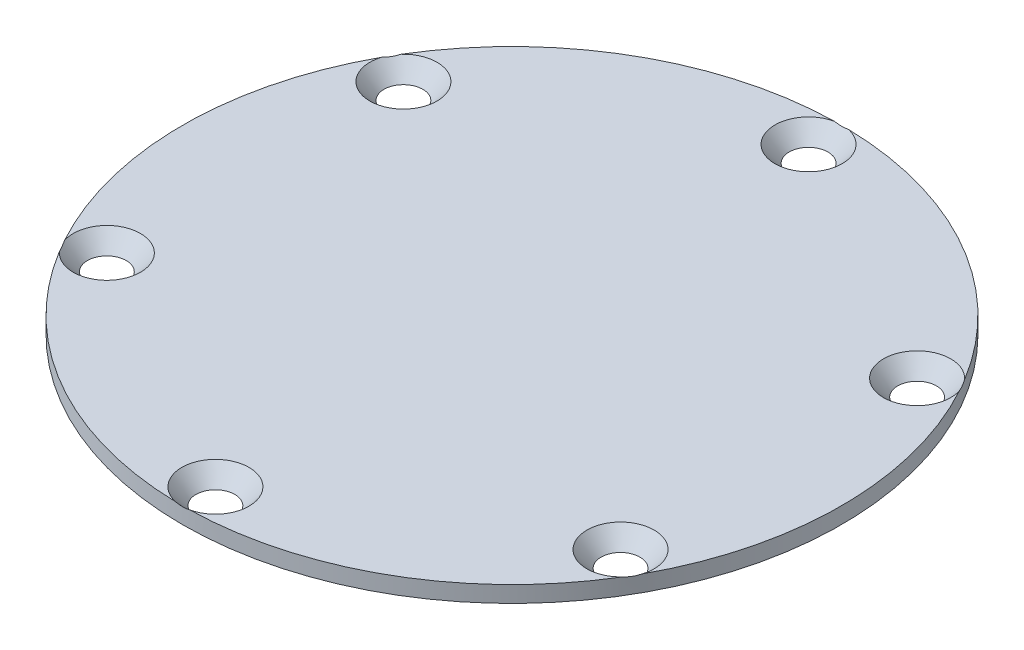
ISO-10303-21;
HEADER;
FILE_DESCRIPTION(('STEP AP214'),'2;1');
FILE_NAME('part.step','',(''),(''),'','','');
FILE_SCHEMA(('AUTOMOTIVE_DESIGN { 1 0 10303 214 1 1 1 1 }'));
ENDSEC;
DATA;
#1=APPLICATION_CONTEXT('core data for automotive mechanical design processes');
#2=APPLICATION_PROTOCOL_DEFINITION('international standard','automotive_design',2000,#1);
#3=PRODUCT_CONTEXT('',#1,'mechanical');
#4=PRODUCT('Part','Part','',(#3));
#5=PRODUCT_RELATED_PRODUCT_CATEGORY('part','',(#4));
#6=PRODUCT_DEFINITION_FORMATION('','',#4);
#7=PRODUCT_DEFINITION_CONTEXT('part definition',#1,'design');
#8=PRODUCT_DEFINITION('design','',#6,#7);
#9=PRODUCT_DEFINITION_SHAPE('','',#8);
#10=(LENGTH_UNIT() NAMED_UNIT(*) SI_UNIT(.MILLI.,.METRE.));
#11=(NAMED_UNIT(*) PLANE_ANGLE_UNIT() SI_UNIT($,.RADIAN.));
#12=(NAMED_UNIT(*) SI_UNIT($,.STERADIAN.) SOLID_ANGLE_UNIT());
#13=UNCERTAINTY_MEASURE_WITH_UNIT(LENGTH_MEASURE(1.E-05),#10,'distance_accuracy_value','');
#14=(GEOMETRIC_REPRESENTATION_CONTEXT(3) GLOBAL_UNCERTAINTY_ASSIGNED_CONTEXT((#13)) GLOBAL_UNIT_ASSIGNED_CONTEXT((#10,
#11,#12)) REPRESENTATION_CONTEXT('',''));
#15=CARTESIAN_POINT('',(0.,0.,0.));
#16=DIRECTION('',(0.,0.,1.));
#17=DIRECTION('',(1.,0.,0.));
#18=AXIS2_PLACEMENT_3D('',#15,#16,#17);
#19=CARTESIAN_POINT('',(0.,0.,0.));
#20=DIRECTION('',(0.,1.,0.));
#21=DIRECTION('',(0.,0.,1.));
#22=AXIS2_PLACEMENT_3D('',#19,#20,#21);
#23=PLANE('',#22);
#24=CARTESIAN_POINT('',(0.,0.,28.575));
#25=DIRECTION('',(0.,1.,0.));
#26=DIRECTION('',(0.,0.,1.));
#27=AXIS2_PLACEMENT_3D('',#24,#25,#26);
#28=CIRCLE('',#27,1.869547245287);
#29=CARTESIAN_POINT('',(0.,0.,30.444547245287));
#30=VERTEX_POINT('',#29);
#31=EDGE_CURVE('E93',#30,#30,#28,.T.);
#32=ORIENTED_EDGE('',*,*,#31,.T.);
#33=EDGE_LOOP('',(#32));
#34=FACE_BOUND('',#33,.T.);
#35=CARTESIAN_POINT('',(-8.12005319797207E-13,0.,-28.575));
#36=DIRECTION('',(0.,1.,0.));
#37=DIRECTION('',(0.,0.,1.));
#38=AXIS2_PLACEMENT_3D('',#35,#36,#37);
#39=CIRCLE('',#38,1.869547245287);
#40=CARTESIAN_POINT('',(-8.12005319797207E-13,0.,-26.705452754713));
#41=VERTEX_POINT('',#40);
#42=EDGE_CURVE('E139',#41,#41,#39,.T.);
#43=ORIENTED_EDGE('',*,*,#42,.T.);
#44=EDGE_LOOP('',(#43));
#45=FACE_BOUND('',#44,.T.);
#46=CARTESIAN_POINT('',(24.7466759131397,0.,-14.2875000000004));
#47=DIRECTION('',(0.,1.,0.));
#48=DIRECTION('',(0.,0.,1.));
#49=AXIS2_PLACEMENT_3D('',#46,#47,#48);
#50=CIRCLE('',#49,1.869547245287);
#51=CARTESIAN_POINT('',(24.7466759131397,0.,-12.4179527547134));
#52=VERTEX_POINT('',#51);
#53=EDGE_CURVE('E116',#52,#52,#50,.T.);
#54=ORIENTED_EDGE('',*,*,#53,.T.);
#55=EDGE_LOOP('',(#54));
#56=FACE_BOUND('',#55,.T.);
#57=CARTESIAN_POINT('',(24.7466759131402,0.,14.2875000000003));
#58=DIRECTION('',(0.,1.,0.));
#59=DIRECTION('',(0.,0.,1.));
#60=AXIS2_PLACEMENT_3D('',#57,#58,#59);
#61=CIRCLE('',#60,1.86954724528701);
#62=CARTESIAN_POINT('',(24.7466759131402,0.,16.1570472452873));
#63=VERTEX_POINT('',#62);
#64=EDGE_CURVE('E107',#63,#63,#61,.T.);
#65=ORIENTED_EDGE('',*,*,#64,.T.);
#66=EDGE_LOOP('',(#65));
#67=FACE_BOUND('',#66,.T.);
#68=CARTESIAN_POINT('',(0.,0.,0.));
#69=DIRECTION('',(0.,1.,0.));
#70=DIRECTION('',(0.,0.,1.));
#71=AXIS2_PLACEMENT_3D('',#68,#69,#70);
#72=CIRCLE('',#71,31.75);
#73=CARTESIAN_POINT('',(0.,0.,31.75));
#74=VERTEX_POINT('',#73);
#75=EDGE_CURVE('E100',#74,#74,#72,.T.);
#76=ORIENTED_EDGE('',*,*,#75,.F.);
#77=EDGE_LOOP('',(#76));
#78=FACE_BOUND('',#77,.T.);
#79=CARTESIAN_POINT('',(-24.7466759131409,0.,-14.2874999999996));
#80=DIRECTION('',(0.,1.,0.));
#81=DIRECTION('',(0.,0.,1.));
#82=AXIS2_PLACEMENT_3D('',#79,#80,#81);
#83=CIRCLE('',#82,1.869547245287);
#84=CARTESIAN_POINT('',(-24.7466759131409,0.,-12.4179527547126));
#85=VERTEX_POINT('',#84);
#86=EDGE_CURVE('E151',#85,#85,#83,.T.);
#87=ORIENTED_EDGE('',*,*,#86,.T.);
#88=EDGE_LOOP('',(#87));
#89=FACE_BOUND('',#88,.T.);
#90=CARTESIAN_POINT('',(-24.7466759131404,0.,14.2874999999999));
#91=DIRECTION('',(0.,1.,0.));
#92=DIRECTION('',(0.,0.,1.));
#93=AXIS2_PLACEMENT_3D('',#90,#91,#92);
#94=CIRCLE('',#93,1.869547245287);
#95=CARTESIAN_POINT('',(-24.7466759131404,0.,16.1570472452869));
#96=VERTEX_POINT('',#95);
#97=EDGE_CURVE('E154',#96,#96,#94,.T.);
#98=ORIENTED_EDGE('',*,*,#97,.T.);
#99=EDGE_LOOP('',(#98));
#100=FACE_BOUND('',#99,.T.);
#101=ADVANCED_FACE('F30',(#34,#45,#56,#67,#78,#89,#100),#23,.F.);
#102=CARTESIAN_POINT('',(0.,1.5748,0.));
#103=DIRECTION('',(0.,-1.,0.));
#104=DIRECTION('',(0.,0.,-1.));
#105=AXIS2_PLACEMENT_3D('',#102,#103,#104);
#106=CYLINDRICAL_SURFACE('',#105,31.75);
#107=CARTESIAN_POINT('',(0.,1.5748,0.));
#108=DIRECTION('',(0.,1.,0.));
#109=DIRECTION('',(0.,0.,1.));
#110=AXIS2_PLACEMENT_3D('',#107,#108,#109);
#111=CIRCLE('',#110,31.75);
#112=CARTESIAN_POINT('',(0.672649443689606,1.5748,31.7428738888889));
#113=VERTEX_POINT('',#112);
#114=CARTESIAN_POINT('',(27.1538104550585,1.5748,16.4539684505214));
#115=VERTEX_POINT('',#114);
#116=EDGE_CURVE('E92',#113,#115,#111,.T.);
#117=ORIENTED_EDGE('',*,*,#116,.F.);
#118=CARTESIAN_POINT('',(1.09031552451744,1.69074426435057,31.7312734074288));
#119=CARTESIAN_POINT('',(1.02214175287471,1.66767775963925,31.7336164497487));
#120=CARTESIAN_POINT('',(0.953344267765002,1.64637135807717,31.7357598974846));
#121=CARTESIAN_POINT('',(0.814389278131831,1.60763322335784,31.7396299643716));
#122=CARTESIAN_POINT('',(0.744227739597767,1.59021585322567,31.7413550403422));
#123=CARTESIAN_POINT('',(0.592579266661105,1.55755497316155,31.7445729583715));
#124=CARTESIAN_POINT('',(0.510939017258164,1.54300377414767,31.7459947516722));
#125=CARTESIAN_POINT('',(0.346743046490625,1.52022721119982,31.7482127122931));
#126=CARTESIAN_POINT('',(0.264187093915714,1.51200348358402,31.7490087177825));
#127=CARTESIAN_POINT('',(0.0988036954339166,1.50223347680404,31.7499537755481));
#128=CARTESIAN_POINT('',(0.0159768828527277,1.50067668938227,31.7501038459324));
#129=CARTESIAN_POINT('',(-0.149500184570136,1.5042797955152,31.7497557722573));
#130=CARTESIAN_POINT('',(-0.232150494198283,1.50943715732033,31.7492578725324));
#131=CARTESIAN_POINT('',(-0.374809162620884,1.52399960556356,31.7478450453665));
#132=CARTESIAN_POINT('',(-0.434977611882835,1.53190508661029,31.7470767445004));
#133=CARTESIAN_POINT('',(-0.554733878783343,1.55102448658315,31.7452099615717));
#134=CARTESIAN_POINT('',(-0.614322072097732,1.56223609431115,31.7441117101559));
#135=CARTESIAN_POINT('',(-0.790865328449437,1.60026361682261,31.7403651622483));
#136=CARTESIAN_POINT('',(-0.906852906903011,1.63160856916822,31.7372521618716));
#137=CARTESIAN_POINT('',(-1.13559223265953,1.7044875132262,31.7298922351875));
#138=CARTESIAN_POINT('',(-1.24834042327925,1.7460322595719,31.725644111589));
#139=CARTESIAN_POINT('',(-1.47095754625675,1.83753867386555,31.7161041217856));
#140=CARTESIAN_POINT('',(-1.5808088117105,1.88754228689325,31.7108070305515));
#141=CARTESIAN_POINT('',(-1.79717019831145,1.99407002722115,31.6992809508829));
#142=CARTESIAN_POINT('',(-1.90368145059756,2.05059191601523,31.693052282154));
#143=CARTESIAN_POINT('',(-2.1055013737736,2.16414709413824,31.6802585020194));
#144=CARTESIAN_POINT('',(-2.20103403341463,2.22079353006111,31.6737579607654));
#145=CARTESIAN_POINT('',(-2.38908982783487,2.33717455085278,31.6601252620092));
#146=CARTESIAN_POINT('',(-2.48163103791141,2.39688049801662,31.6529986300116));
#147=CARTESIAN_POINT('',(-2.57320401108678,2.45794436256946,31.6455545237767));
#148=B_SPLINE_CURVE_WITH_KNOTS('',3,(#118,#119,#120,#121,#122,#123,#124,#125,#126,#127,#128,
#129,#130,#131,#132,#133,#134,#135,#136,#137,#138,#139,#140,#141,#142,#143,#144,#145,#146,#147),
.UNSPECIFIED.,.F.,.F.,(4,2,2,2,2,2,2,2,2,2,2,2,2,2,4),(0.,0.216029677583202,0.43284446645297,
0.681423350246658,0.930066496291742,1.17831759290749,1.4264751069149,1.60845256445231,
1.79030310824688,2.15024015019967,2.51055835102308,2.87271865386868,3.23475495193751,
3.56843293407399,3.89941586334941),.UNSPECIFIED.);
#149=CARTESIAN_POINT('',(-0.672649443689607,1.5748,31.7428738888889));
#150=VERTEX_POINT('',#149);
#151=EDGE_CURVE('E45',#113,#150,#148,.T.);
#152=ORIENTED_EDGE('',*,*,#151,.T.);
#153=CARTESIAN_POINT('',(-27.1538104550586,1.5748,16.4539684505213));
#154=VERTEX_POINT('',#153);
#155=EDGE_CURVE('E90',#154,#150,#111,.T.);
#156=ORIENTED_EDGE('',*,*,#155,.F.);
#157=CARTESIAN_POINT('',(-25.7090932888892,2.96686947245007,18.6307547421781));
#158=CARTESIAN_POINT('',(-25.7558029542759,2.9061145620144,18.5662971672379));
#159=CARTESIAN_POINT('',(-25.8025840165621,2.84604512076919,18.5012340683505));
#160=CARTESIAN_POINT('',(-25.8963705099006,2.72756013449007,18.3697314857725));
#161=CARTESIAN_POINT('',(-25.9433760069667,2.66914511621612,18.3032915751169));
#162=CARTESIAN_POINT('',(-26.0380200996219,2.55385632820361,18.1684023687415));
#163=CARTESIAN_POINT('',(-26.0856607947693,2.49699755308415,18.0999416776304));
#164=CARTESIAN_POINT('',(-26.1812934083847,2.38569726405393,17.9613325417688));
#165=CARTESIAN_POINT('',(-26.2292852928361,2.33125551954495,17.8911842590128));
#166=CARTESIAN_POINT('',(-26.3262138021535,2.22472396644305,17.7482533857157));
#167=CARTESIAN_POINT('',(-26.3751550575029,2.1726647526061,17.6754509030112));
#168=CARTESIAN_POINT('',(-26.4735554169466,2.07217466262905,17.5277279476374));
#169=CARTESIAN_POINT('',(-26.5230146092001,2.02374441601138,17.4528071105844));
#170=CARTESIAN_POINT('',(-26.6719811501891,1.88534899264817,17.2250036870811));
#171=CARTESIAN_POINT('',(-26.7724417574076,1.80186629134991,17.0685444951165));
#172=CARTESIAN_POINT('',(-26.8970499795081,1.71535953268309,16.8704795862657));
#173=CARTESIAN_POINT('',(-26.9201968596413,1.70000124269274,16.8335208186879));
#174=CARTESIAN_POINT('',(-26.9665972341273,1.67074379114588,16.7590888193919));
#175=CARTESIAN_POINT('',(-26.9898507395945,1.65684478548343,16.7216155331905));
#176=CARTESIAN_POINT('',(-27.059728391042,1.61752311877193,16.6084752613587));
#177=CARTESIAN_POINT('',(-27.1064925822391,1.59445969033924,16.5320514694781));
#178=CARTESIAN_POINT('',(-27.1952997907478,1.55756171636189,16.3855036183536));
#179=CARTESIAN_POINT('',(-27.2373286255936,1.54301736820841,16.315549803727));
#180=CARTESIAN_POINT('',(-27.3213032859105,1.52024715981973,16.1745361294311));
#181=CARTESIAN_POINT('',(-27.3632490920152,1.51202263219393,16.1034760397116));
#182=CARTESIAN_POINT('',(-27.4467592545746,1.50223902600405,15.9607249493718));
#183=CARTESIAN_POINT('',(-27.4883238058011,1.5006763302821,15.889034312314));
#184=CARTESIAN_POINT('',(-27.5708034104708,1.50427465471337,15.745480227737));
#185=CARTESIAN_POINT('',(-27.6117186992592,1.50943317946892,15.6736168542354));
#186=CARTESIAN_POINT('',(-27.6818454500906,1.52399952571111,15.5493273329975));
#187=CARTESIAN_POINT('',(-27.7112645954442,1.53190474317245,15.4968353137275));
#188=CARTESIAN_POINT('',(-27.7695271559659,1.55102574002515,15.392187763109));
#189=CARTESIAN_POINT('',(-27.7983709837161,1.56223904871365,15.3400320102154));
#190=CARTESIAN_POINT('',(-27.8525221039375,1.58645437748631,15.2414678745939));
#191=CARTESIAN_POINT('',(-27.8778891155842,1.59915570071268,15.1950177968014));
#192=CARTESIAN_POINT('',(-27.9281176374137,1.6268812990813,15.1025004231434));
#193=CARTESIAN_POINT('',(-27.9529787827489,1.64190718795855,15.0564334167998));
#194=CARTESIAN_POINT('',(-28.0434786316505,1.7011241730249,14.8877543245464));
#195=CARTESIAN_POINT('',(-28.1074705076747,1.7519112143533,14.7665386275282));
#196=CARTESIAN_POINT('',(-28.2317285111665,1.86532732149729,14.527567506241));
#197=CARTESIAN_POINT('',(-28.291986014826,1.92798253425477,14.4098203983446));
#198=CARTESIAN_POINT('',(-28.4088816222044,2.06199281889348,14.1779673668516));
#199=CARTESIAN_POINT('',(-28.4655271091666,2.13332921627579,14.0638542709543));
#200=CARTESIAN_POINT('',(-28.5480492522899,2.24511403299085,13.8951529448884));
#201=CARTESIAN_POINT('',(-28.5750888239902,2.28307844627657,13.8394573706333));
#202=CARTESIAN_POINT('',(-28.6284462349614,2.36043576216881,13.7287412785993));
#203=CARTESIAN_POINT('',(-28.6547642684403,2.39982827362791,13.6737205814194));
#204=CARTESIAN_POINT('',(-28.6807508809696,2.43984163256622,13.6189951502952));
#205=B_SPLINE_CURVE_WITH_KNOTS('',3,(#157,#158,#159,#160,#161,#162,#163,#164,#165,#166,#167,
#168,#169,#170,#171,#172,#173,#174,#175,#176,#177,#178,#179,#180,#181,#182,#183,#184,#185,#186,
#187,#188,#189,#190,#191,#192,#193,#194,#195,#196,#197,#198,#199,#200,#201,#202,#203,#204),
.UNSPECIFIED.,.F.,.F.,(4,2,2,2,2,2,2,2,2,2,2,2,2,2,2,2,2,2,2,2,2,2,2,4),(0.,0.300422029403775,
0.600938660183381,0.9037277112612,1.20648781221931,1.51241798777635,1.81840111122929,
2.42806899035371,2.56675277728764,2.70545136464583,2.98271105984259,3.23116995732933,
3.47968123096682,3.72805755387257,3.97634168799766,4.15832347536934,4.34016968923243,
4.50339695424882,4.66673804587539,5.10443496495272,5.54310763864613,5.9808528119569,
6.19871335685714,6.41651467532562),.UNSPECIFIED.);
#206=CARTESIAN_POINT('',(-27.8264598987485,1.5748,15.2889054383674));
#207=VERTEX_POINT('',#206);
#208=EDGE_CURVE('E51',#154,#207,#205,.T.);
#209=ORIENTED_EDGE('',*,*,#208,.T.);
#210=CARTESIAN_POINT('',(-27.8264598987496,1.5748,-15.2889054383655));
#211=VERTEX_POINT('',#210);
#212=EDGE_CURVE('E97',#211,#207,#111,.T.);
#213=ORIENTED_EDGE('',*,*,#212,.F.);
#214=CARTESIAN_POINT('',(-28.6807508809696,2.43984163256554,-13.6189951502952));
#215=CARTESIAN_POINT('',(-28.6502026837812,2.39281099897732,-13.6833261070086));
#216=CARTESIAN_POINT('',(-28.6191948343647,2.34662600338928,-13.7480696765797));
#217=CARTESIAN_POINT('',(-28.5561656899829,2.25627202461598,-13.8785144215204));
#218=CARTESIAN_POINT('',(-28.5241439201654,2.21210401042353,-13.9442160375654));
#219=CARTESIAN_POINT('',(-28.4587290521825,2.12576787941639,-14.0772433857493));
#220=CARTESIAN_POINT('',(-28.4253262158327,2.08362130412721,-14.1445784075367));
#221=CARTESIAN_POINT('',(-28.3573464477859,2.00222321839922,-14.2803769165772));
#222=CARTESIAN_POINT('',(-28.3227696631357,1.9629713473141,-14.3488402619494));
#223=CARTESIAN_POINT('',(-28.2160847569931,1.84917670681963,-14.5581545110572));
#224=CARTESIAN_POINT('',(-28.1419915604474,1.77991268077186,-14.7009528382795));
#225=CARTESIAN_POINT('',(-27.9883906898915,1.66120371119353,-14.9913052409934));
#226=CARTESIAN_POINT('',(-27.9089059548047,1.61168029329836,-15.1388379149134));
#227=CARTESIAN_POINT('',(-27.7877965002054,1.55750454838951,-15.3592802429356));
#228=CARTESIAN_POINT('',(-27.7481136668105,1.54293092992399,-15.4308609938663));
#229=CARTESIAN_POINT('',(-27.6677367158913,1.52013332961282,-15.5745179968165));
#230=CARTESIAN_POINT('',(-27.6270422729994,1.51191141869284,-15.6465944027194));
#231=CARTESIAN_POINT('',(-27.5451592838983,1.50220547544207,-15.7902975496513));
#232=CARTESIAN_POINT('',(-27.5039756847959,1.50067789002984,-15.8619241605946));
#233=CARTESIAN_POINT('',(-27.4211385181659,1.50430542284589,-16.0047014811993));
#234=CARTESIAN_POINT('',(-27.3794851387196,1.50945795462284,-16.0758523643369));
#235=CARTESIAN_POINT('',(-27.3070476076877,1.52399720460283,-16.198496695348));
#236=CARTESIAN_POINT('',(-27.2763099282254,1.53189896526217,-16.2502000399222));
#237=CARTESIAN_POINT('',(-27.2148151289313,1.55101581844783,-16.3529790996471));
#238=CARTESIAN_POINT('',(-27.1840580078059,1.56223116134305,-16.4040547670678));
#239=CARTESIAN_POINT('',(-27.0925960073273,1.60023613514642,-16.5549829456446));
#240=CARTESIAN_POINT('',(-27.0319721863701,1.63154037355943,-16.6537686125631));
#241=CARTESIAN_POINT('',(-26.9113598463361,1.7043171369459,-16.8479765550071));
#242=CARTESIAN_POINT('',(-26.8513720531188,1.74580019743876,-16.9433952277512));
#243=CARTESIAN_POINT('',(-26.7318001793794,1.83726900311887,-17.1314291175858));
#244=CARTESIAN_POINT('',(-26.6722222373958,1.8873145744703,-17.2240188020181));
#245=CARTESIAN_POINT('',(-26.5539291420616,1.99394271269451,-17.4058355051018));
#246=CARTESIAN_POINT('',(-26.4952137476933,2.05052341275819,-17.4950634744414));
#247=CARTESIAN_POINT('',(-26.3743811759257,2.1730481948581,-17.6767432592334));
#248=CARTESIAN_POINT('',(-26.3123187513251,2.2393719328977,-17.7689736048807));
#249=CARTESIAN_POINT('',(-26.1888724991603,2.37664516651534,-17.9504177294193));
#250=CARTESIAN_POINT('',(-26.1274888476866,2.44759583096457,-18.0396307373479));
#251=CARTESIAN_POINT('',(-26.0063848925868,2.59176358614801,-18.2137720332748));
#252=CARTESIAN_POINT('',(-25.9466548886632,2.66491396193897,-18.2987491555541));
#253=CARTESIAN_POINT('',(-25.8276103395807,2.81397516969903,-18.4663900411613));
#254=CARTESIAN_POINT('',(-25.7682954918466,2.88988367018021,-18.5490556584336));
#255=CARTESIAN_POINT('',(-25.7090932888893,2.9668694724501,-18.6307547421779));
#256=B_SPLINE_CURVE_WITH_KNOTS('',3,(#214,#215,#216,#217,#218,#219,#220,#221,#222,#223,#224,
#225,#226,#227,#228,#229,#230,#231,#232,#233,#234,#235,#236,#237,#238,#239,#240,#241,#242,#243,
#244,#245,#246,#247,#248,#249,#250,#251,#252,#253,#254,#255),.UNSPECIFIED.,.F.,.F.,(4,2,2,2,2,2,
2,2,2,2,2,2,2,2,2,2,2,2,2,2,4),(0.,0.25603818468856,0.512198107637384,0.77066024676697,
1.02909012994181,1.55362370598238,2.07605080863036,2.32523360605356,2.57449761337426,
2.82213748587317,3.06968150418025,3.25158863168719,3.43350950731862,3.79305511101279,
4.15297444142355,4.51551968798688,4.87796162569673,5.26615859448011,5.65445401378234,
6.03552608384764,6.41628319762395),.UNSPECIFIED.);
#257=CARTESIAN_POINT('',(-27.1538104550581,1.5748,-16.4539684505221));
#258=VERTEX_POINT('',#257);
#259=EDGE_CURVE('E166',#211,#258,#256,.T.);
#260=ORIENTED_EDGE('',*,*,#259,.T.);
#261=CARTESIAN_POINT('',(-0.672649443690508,1.5748,-31.7428738888889));
#262=VERTEX_POINT('',#261);
#263=EDGE_CURVE('E99',#262,#258,#111,.T.);
#264=ORIENTED_EDGE('',*,*,#263,.F.);
#265=CARTESIAN_POINT('',(-1.0903155245183,1.69074426435056,-31.7312734074287));
#266=CARTESIAN_POINT('',(-1.02214175287558,1.66767775963924,-31.7336164497487));
#267=CARTESIAN_POINT('',(-0.95334426776588,1.64637135807716,-31.7357598974846));
#268=CARTESIAN_POINT('',(-0.81438927813272,1.60763322335784,-31.7396299643716));
#269=CARTESIAN_POINT('',(-0.744227739598661,1.59021585322567,-31.7413550403422));
#270=CARTESIAN_POINT('',(-0.592579266662004,1.55755497316155,-31.7445729583715));
#271=CARTESIAN_POINT('',(-0.510939017259064,1.54300377414766,-31.7459947516722));
#272=CARTESIAN_POINT('',(-0.346743046491525,1.52022721119981,-31.7482127122931));
#273=CARTESIAN_POINT('',(-0.264187093916615,1.51200348358402,-31.7490087177825));
#274=CARTESIAN_POINT('',(-0.098803695434817,1.50223347680404,-31.7499537755481));
#275=CARTESIAN_POINT('',(-0.0159768828536282,1.50067668938227,-31.7501038459324));
#276=CARTESIAN_POINT('',(0.149500184569235,1.50427979551519,-31.7497557722573));
#277=CARTESIAN_POINT('',(0.232150494197383,1.50943715732032,-31.7492578725324));
#278=CARTESIAN_POINT('',(0.374809162619984,1.52399960556356,-31.7478450453665));
#279=CARTESIAN_POINT('',(0.434977611881935,1.53190508661029,-31.7470767445004));
#280=CARTESIAN_POINT('',(0.554733878782443,1.55102448658315,-31.7452099615717));
#281=CARTESIAN_POINT('',(0.614322072096833,1.56223609431116,-31.7441117101559));
#282=CARTESIAN_POINT('',(0.790865328448538,1.60026361682261,-31.7403651622483));
#283=CARTESIAN_POINT('',(0.906852906902113,1.63160856916822,-31.7372521618716));
#284=CARTESIAN_POINT('',(1.13559223265863,1.7044875132262,-31.7298922351875));
#285=CARTESIAN_POINT('',(1.24834042327835,1.74603225957191,-31.725644111589));
#286=CARTESIAN_POINT('',(1.47095754625585,1.83753867386555,-31.7161041217857));
#287=CARTESIAN_POINT('',(1.58080881170961,1.88754228689325,-31.7108070305515));
#288=CARTESIAN_POINT('',(1.79717019831056,1.99407002722115,-31.699280950883));
#289=CARTESIAN_POINT('',(1.90368145059666,2.05059191601523,-31.693052282154));
#290=CARTESIAN_POINT('',(2.10550137377273,2.16414709413825,-31.6802585020194));
#291=CARTESIAN_POINT('',(2.20103403341377,2.22079353006113,-31.6737579607654));
#292=CARTESIAN_POINT('',(2.38908982783405,2.33717455085282,-31.6601252620093));
#293=CARTESIAN_POINT('',(2.4816310379106,2.39688049801667,-31.6529986300117));
#294=CARTESIAN_POINT('',(2.57320401108598,2.45794436256952,-31.6455545237768));
#295=B_SPLINE_CURVE_WITH_KNOTS('',3,(#265,#266,#267,#268,#269,#270,#271,#272,#273,#274,#275,
#276,#277,#278,#279,#280,#281,#282,#283,#284,#285,#286,#287,#288,#289,#290,#291,#292,#293,#294),
.UNSPECIFIED.,.F.,.F.,(4,2,2,2,2,2,2,2,2,2,2,2,2,2,4),(0.,0.216029677583185,0.432844466452935,
0.681423350246622,0.930066496291707,1.17831759290746,1.42647510691486,1.60845256445228,
1.79030310824685,2.15024015019963,2.51055835102305,2.87271865386865,3.23475495193747,
3.56843293407402,3.89941586334949),.UNSPECIFIED.);
#296=CARTESIAN_POINT('',(0.672649443688706,1.5748,-31.7428738888889));
#297=VERTEX_POINT('',#296);
#298=EDGE_CURVE('E186',#262,#297,#295,.T.);
#299=ORIENTED_EDGE('',*,*,#298,.T.);
#300=CARTESIAN_POINT('',(27.1538104550592,1.5748,-16.4539684505203));
#301=VERTEX_POINT('',#300);
#302=EDGE_CURVE('E106',#301,#297,#111,.T.);
#303=ORIENTED_EDGE('',*,*,#302,.F.);
#304=CARTESIAN_POINT('',(25.709093288889,2.96686947245003,-18.6307547421784));
#305=CARTESIAN_POINT('',(25.7558029542757,2.90611456201438,-18.5662971672382));
#306=CARTESIAN_POINT('',(25.8025840165618,2.8460451207692,-18.5012340683508));
#307=CARTESIAN_POINT('',(25.8963705099003,2.72756013449013,-18.3697314857728));
#308=CARTESIAN_POINT('',(25.9433760069665,2.66914511621621,-18.3032915751173));
#309=CARTESIAN_POINT('',(26.0380200996216,2.55385632820375,-18.168402368742));
#310=CARTESIAN_POINT('',(26.085660794769,2.4969975530843,-18.0999416776309));
#311=CARTESIAN_POINT('',(26.1812934083843,2.38569726405413,-17.9613325417693));
#312=CARTESIAN_POINT('',(26.2292852928357,2.33125551954518,-17.8911842590133));
#313=CARTESIAN_POINT('',(26.3262138021531,2.22472396644331,-17.7482533857163));
#314=CARTESIAN_POINT('',(26.3751550575025,2.17266475260636,-17.6754509030117));
#315=CARTESIAN_POINT('',(26.4735554169463,2.07217466262933,-17.5277279476379));
#316=CARTESIAN_POINT('',(26.5230146091997,2.02374441601166,-17.4528071105849));
#317=CARTESIAN_POINT('',(26.6719811501887,1.88534899264846,-17.2250036870816));
#318=CARTESIAN_POINT('',(26.7724417574072,1.80186629135021,-17.068544495117));
#319=CARTESIAN_POINT('',(26.8970499795082,1.71535953268313,-16.8704795862656));
#320=CARTESIAN_POINT('',(26.9201968596418,1.70000124269253,-16.8335208186872));
#321=CARTESIAN_POINT('',(26.9665972341286,1.67074379114523,-16.7590888193898));
#322=CARTESIAN_POINT('',(26.9898507395962,1.65684478548258,-16.7216155331878));
#323=CARTESIAN_POINT('',(27.0597283910449,1.61752311877057,-16.608475261354));
#324=CARTESIAN_POINT('',(27.1064925822429,1.59445969033768,-16.532051469472));
#325=CARTESIAN_POINT('',(27.1952997907523,1.55756171636048,-16.3855036183462));
#326=CARTESIAN_POINT('',(27.2373286255981,1.54301736820724,-16.3155498037196));
#327=CARTESIAN_POINT('',(27.3213032859149,1.52024715981906,-16.1745361294236));
#328=CARTESIAN_POINT('',(27.3632490920196,1.51202263219352,-16.1034760397041));
#329=CARTESIAN_POINT('',(27.4467592545789,1.50223902600415,-15.9607249493643));
#330=CARTESIAN_POINT('',(27.4883238058054,1.50067633028246,-15.8890343123065));
#331=CARTESIAN_POINT('',(27.570803410475,1.50427465471423,-15.7454802277295));
#332=CARTESIAN_POINT('',(27.6117186992634,1.50943317947003,-15.673616854228));
#333=CARTESIAN_POINT('',(27.6818454500932,1.52399952571231,-15.5493273329929));
#334=CARTESIAN_POINT('',(27.7112645954452,1.53190474317332,-15.4968353137256));
#335=CARTESIAN_POINT('',(27.7695271559639,1.55102574002501,-15.3921877631125));
#336=CARTESIAN_POINT('',(27.7983709837126,1.56223904871283,-15.3400320102217));
#337=CARTESIAN_POINT('',(27.8525221039334,1.58645437748487,-15.2414678746014));
#338=CARTESIAN_POINT('',(27.8778891155809,1.59915570071152,-15.1950177968075));
#339=CARTESIAN_POINT('',(27.928117637412,1.62688129908085,-15.1025004231467));
#340=CARTESIAN_POINT('',(27.9529787827479,1.64190718795852,-15.0564334168016));
#341=CARTESIAN_POINT('',(28.0434786316503,1.70112417302538,-14.8877543245467));
#342=CARTESIAN_POINT('',(28.1074705076745,1.75191121435381,-14.7665386275286));
#343=CARTESIAN_POINT('',(28.2317285111664,1.86532732149787,-14.5275675062413));
#344=CARTESIAN_POINT('',(28.2919860148259,1.92798253425538,-14.4098203983448));
#345=CARTESIAN_POINT('',(28.4088816222043,2.06199281889414,-14.1779673668518));
#346=CARTESIAN_POINT('',(28.4655271091666,2.13332921627645,-14.0638542709544));
#347=CARTESIAN_POINT('',(28.5480492522898,2.24511403299153,-13.8951529448886));
#348=CARTESIAN_POINT('',(28.5750888239902,2.28307844627725,-13.8394573706334));
#349=CARTESIAN_POINT('',(28.6284462349613,2.3604357621695,-13.7287412785995));
#350=CARTESIAN_POINT('',(28.6547642684402,2.39982827362861,-13.6737205814195));
#351=CARTESIAN_POINT('',(28.6807508809695,2.43984163256693,-13.6189951502953));
#352=B_SPLINE_CURVE_WITH_KNOTS('',3,(#304,#305,#306,#307,#308,#309,#310,#311,#312,#313,#314,
#315,#316,#317,#318,#319,#320,#321,#322,#323,#324,#325,#326,#327,#328,#329,#330,#331,#332,#333,
#334,#335,#336,#337,#338,#339,#340,#341,#342,#343,#344,#345,#346,#347,#348,#349,#350,#351),
.UNSPECIFIED.,.F.,.F.,(4,2,2,2,2,2,2,2,2,2,2,2,2,2,2,2,2,2,2,2,2,2,2,4),(0.,0.300422029403671,
0.600938660183175,0.903727711260884,1.20648781221889,1.51241798777594,1.81840111122889,
2.42806899035333,2.56675277728963,2.70545136465021,2.98271105985169,3.23116995733832,
3.47968123097571,3.72805755388137,3.97634168800635,4.15832347536856,4.34016968922219,
4.50339695424355,4.6667380458751,5.10443496495259,5.54310763864617,5.98085281195698,
6.19871335685723,6.41651467532572),.UNSPECIFIED.);
#353=CARTESIAN_POINT('',(27.8264598987472,1.5748,-15.2889054383698));
#354=VERTEX_POINT('',#353);
#355=EDGE_CURVE('E193',#301,#354,#352,.T.);
#356=ORIENTED_EDGE('',*,*,#355,.T.);
#357=CARTESIAN_POINT('',(27.8264598987481,1.5748,15.2889054383681));
#358=VERTEX_POINT('',#357);
#359=EDGE_CURVE('E101',#358,#354,#111,.T.);
#360=ORIENTED_EDGE('',*,*,#359,.F.);
#361=CARTESIAN_POINT('',(28.6807508809694,2.43984163256625,13.6189951502955));
#362=CARTESIAN_POINT('',(28.650202683781,2.39281099897798,13.683326107009));
#363=CARTESIAN_POINT('',(28.6191948343644,2.34662600338987,13.7480696765802));
#364=CARTESIAN_POINT('',(28.5561656899825,2.25627202461646,13.8785144215211));
#365=CARTESIAN_POINT('',(28.524143920165,2.21210401042395,13.9442160375662));
#366=CARTESIAN_POINT('',(28.4587290521821,2.12576787941671,14.0772433857503));
#367=CARTESIAN_POINT('',(28.4253262158322,2.08362130412748,14.1445784075378));
#368=CARTESIAN_POINT('',(28.3573464477853,2.0022232183994,14.2803769165784));
#369=CARTESIAN_POINT('',(28.322769663135,1.96297134731424,14.3488402619507));
#370=CARTESIAN_POINT('',(28.2160847569923,1.84917670681965,14.5581545110587));
#371=CARTESIAN_POINT('',(28.1419915604464,1.77991268077184,14.7009528382812));
#372=CARTESIAN_POINT('',(27.9883906898904,1.66120371119347,14.9913052409955));
#373=CARTESIAN_POINT('',(27.9089059548034,1.61168029329831,15.1388379149157));
#374=CARTESIAN_POINT('',(27.787796500204,1.55750454838955,15.3592802429382));
#375=CARTESIAN_POINT('',(27.7481136668091,1.54293092992408,15.4308609938688));
#376=CARTESIAN_POINT('',(27.6677367158899,1.52013332961301,15.574517996819));
#377=CARTESIAN_POINT('',(27.627042272998,1.51191141869308,15.6465944027219));
#378=CARTESIAN_POINT('',(27.5451592838968,1.50220547544242,15.7902975496538));
#379=CARTESIAN_POINT('',(27.5039756847945,1.50067789003024,15.8619241605971));
#380=CARTESIAN_POINT('',(27.4211385181644,1.50430542284639,16.0047014812018));
#381=CARTESIAN_POINT('',(27.3794851387181,1.50945795462338,16.0758523643394));
#382=CARTESIAN_POINT('',(27.3070476076865,1.5239972046034,16.1984966953501));
#383=CARTESIAN_POINT('',(27.2763099282244,1.5318989652627,16.2502000399238));
#384=CARTESIAN_POINT('',(27.2148151289309,1.55101581844819,16.3529790996478));
#385=CARTESIAN_POINT('',(27.1840580078057,1.5622311613433,16.404054767068));
#386=CARTESIAN_POINT('',(27.0925960073274,1.60023613514647,16.5549829456444));
#387=CARTESIAN_POINT('',(27.0319721863703,1.63154037355942,16.6537686125629));
#388=CARTESIAN_POINT('',(26.9113598463363,1.70431713694577,16.8479765550068));
#389=CARTESIAN_POINT('',(26.851372053119,1.74580019743857,16.9433952277509));
#390=CARTESIAN_POINT('',(26.7318001793797,1.83726900311855,17.1314291175853));
#391=CARTESIAN_POINT('',(26.6722222373961,1.88731457446991,17.2240188020176));
#392=CARTESIAN_POINT('',(26.5539291420619,1.99394271269399,17.4058355051013));
#393=CARTESIAN_POINT('',(26.4952137476937,2.0505234127576,17.4950634744409));
#394=CARTESIAN_POINT('',(26.374381175926,2.17304819485747,17.6767432592329));
#395=CARTESIAN_POINT('',(26.3123187513254,2.23937193289711,17.7689736048803));
#396=CARTESIAN_POINT('',(26.1888724991604,2.37664516651482,17.9504177294191));
#397=CARTESIAN_POINT('',(26.1274888476867,2.4475958309641,18.0396307373478));
#398=CARTESIAN_POINT('',(26.0063848925867,2.59176358614764,18.2137720332749));
#399=CARTESIAN_POINT('',(25.9466548886631,2.66491396193865,18.2987491555543));
#400=CARTESIAN_POINT('',(25.8276103395805,2.81397516969881,18.4663900411616));
#401=CARTESIAN_POINT('',(25.7682954918464,2.88988367018005,18.549055658434));
#402=CARTESIAN_POINT('',(25.709093288889,2.96686947245001,18.6307547421784));
#403=B_SPLINE_CURVE_WITH_KNOTS('',3,(#361,#362,#363,#364,#365,#366,#367,#368,#369,#370,#371,
#372,#373,#374,#375,#376,#377,#378,#379,#380,#381,#382,#383,#384,#385,#386,#387,#388,#389,#390,
#391,#392,#393,#394,#395,#396,#397,#398,#399,#400,#401,#402),.UNSPECIFIED.,.F.,.F.,(4,2,2,2,2,2,
2,2,2,2,2,2,2,2,2,2,2,2,2,2,4),(0.,0.256038184688876,0.51219810763802,0.770660246767936,
1.02909012994311,1.55362370598432,2.07605080863294,2.32523360605614,2.57449761337683,
2.82213748587575,3.06968150418284,3.2515886316882,3.43350950731805,3.79305511101203,
4.1529744414226,4.51551968798572,4.8779616256954,5.26615859447913,5.65445401378172,
6.03552608384735,6.41628319762399),.UNSPECIFIED.);
#404=EDGE_CURVE('E105',#358,#115,#403,.T.);
#405=ORIENTED_EDGE('',*,*,#404,.T.);
#406=EDGE_LOOP('',(#117,#152,#156,#209,#213,#260,#264,#299,#303,#356,#360,#405));
#407=FACE_BOUND('',#406,.T.);
#408=ORIENTED_EDGE('',*,*,#75,.T.);
#409=EDGE_LOOP('',(#408));
#410=FACE_BOUND('',#409,.T.);
#411=ADVANCED_FACE('F32',(#407,#410),#106,.T.);
#412=CARTESIAN_POINT('',(0.,1.5748,0.));
#413=DIRECTION('',(0.,1.,0.));
#414=DIRECTION('',(0.,0.,1.));
#415=AXIS2_PLACEMENT_3D('',#412,#413,#414);
#416=PLANE('',#415);
#417=CARTESIAN_POINT('',(0.,1.5748,28.575));
#418=DIRECTION('',(0.,1.,0.));
#419=DIRECTION('',(0.,0.,1.));
#420=AXIS2_PLACEMENT_3D('',#417,#418,#419);
#421=CIRCLE('',#420,3.2385);
#422=EDGE_CURVE('E80',#113,#150,#421,.T.);
#423=ORIENTED_EDGE('',*,*,#422,.F.);
#424=ORIENTED_EDGE('',*,*,#116,.T.);
#425=CARTESIAN_POINT('',(24.7466759131402,1.5748,14.2875000000003));
#426=DIRECTION('',(0.,1.,0.));
#427=DIRECTION('',(0.,0.,1.));
#428=AXIS2_PLACEMENT_3D('',#425,#426,#427);
#429=CIRCLE('',#428,3.2385);
#430=EDGE_CURVE('E198',#358,#115,#429,.T.);
#431=ORIENTED_EDGE('',*,*,#430,.F.);
#432=ORIENTED_EDGE('',*,*,#359,.T.);
#433=CARTESIAN_POINT('',(24.7466759131397,1.5748,-14.2875000000004));
#434=DIRECTION('',(0.,1.,0.));
#435=DIRECTION('',(0.,0.,1.));
#436=AXIS2_PLACEMENT_3D('',#433,#434,#435);
#437=CIRCLE('',#436,3.2385);
#438=EDGE_CURVE('E39',#301,#354,#437,.T.);
#439=ORIENTED_EDGE('',*,*,#438,.F.);
#440=ORIENTED_EDGE('',*,*,#302,.T.);
#441=CARTESIAN_POINT('',(-8.12005319797207E-13,1.5748,-28.575));
#442=DIRECTION('',(0.,1.,0.));
#443=DIRECTION('',(0.,0.,1.));
#444=AXIS2_PLACEMENT_3D('',#441,#442,#443);
#445=CIRCLE('',#444,3.2385);
#446=EDGE_CURVE('E173',#262,#297,#445,.T.);
#447=ORIENTED_EDGE('',*,*,#446,.F.);
#448=ORIENTED_EDGE('',*,*,#263,.T.);
#449=CARTESIAN_POINT('',(-24.7466759131409,1.5748,-14.2874999999996));
#450=DIRECTION('',(0.,1.,0.));
#451=DIRECTION('',(0.,0.,1.));
#452=AXIS2_PLACEMENT_3D('',#449,#450,#451);
#453=CIRCLE('',#452,3.2385);
#454=EDGE_CURVE('E156',#211,#258,#453,.T.);
#455=ORIENTED_EDGE('',*,*,#454,.F.);
#456=ORIENTED_EDGE('',*,*,#212,.T.);
#457=CARTESIAN_POINT('',(-24.7466759131404,1.5748,14.2874999999999));
#458=DIRECTION('',(0.,1.,0.));
#459=DIRECTION('',(0.,0.,1.));
#460=AXIS2_PLACEMENT_3D('',#457,#458,#459);
#461=CIRCLE('',#460,3.2385);
#462=EDGE_CURVE('E11',#154,#207,#461,.T.);
#463=ORIENTED_EDGE('',*,*,#462,.F.);
#464=ORIENTED_EDGE('',*,*,#155,.T.);
#465=EDGE_LOOP('',(#423,#424,#431,#432,#439,#440,#447,#448,#455,#456,#463,#464));
#466=FACE_BOUND('',#465,.T.);
#467=ADVANCED_FACE('F95',(#466),#416,.T.);
#468=CARTESIAN_POINT('',(24.7466759131402,1.5748,14.2875000000003));
#469=DIRECTION('',(0.,1.,0.));
#470=DIRECTION('',(0.,0.,1.));
#471=AXIS2_PLACEMENT_3D('',#468,#469,#470);
#472=CONICAL_SURFACE('',#471,3.2385,0.715584993317676);
#473=ORIENTED_EDGE('',*,*,#430,.T.);
#474=ORIENTED_EDGE('',*,*,#404,.F.);
#475=EDGE_LOOP('',(#473,#474));
#476=FACE_BOUND('',#475,.T.);
#477=ORIENTED_EDGE('',*,*,#64,.F.);
#478=EDGE_LOOP('',(#477));
#479=FACE_BOUND('',#478,.T.);
#480=ADVANCED_FACE('F118',(#476,#479),#472,.F.);
#481=CARTESIAN_POINT('',(24.7466759131397,1.5748,-14.2875000000004));
#482=DIRECTION('',(0.,1.,0.));
#483=DIRECTION('',(0.,0.,1.));
#484=AXIS2_PLACEMENT_3D('',#481,#482,#483);
#485=CONICAL_SURFACE('',#484,3.2385,0.715584993317676);
#486=ORIENTED_EDGE('',*,*,#53,.F.);
#487=EDGE_LOOP('',(#486));
#488=FACE_BOUND('',#487,.T.);
#489=ORIENTED_EDGE('',*,*,#438,.T.);
#490=ORIENTED_EDGE('',*,*,#355,.F.);
#491=EDGE_LOOP('',(#489,#490));
#492=FACE_BOUND('',#491,.T.);
#493=ADVANCED_FACE('F123',(#488,#492),#485,.F.);
#494=CARTESIAN_POINT('',(-8.12005319797207E-13,1.5748,-28.575));
#495=DIRECTION('',(0.,1.,0.));
#496=DIRECTION('',(0.,0.,1.));
#497=AXIS2_PLACEMENT_3D('',#494,#495,#496);
#498=CONICAL_SURFACE('',#497,3.2385,0.715584993317676);
#499=ORIENTED_EDGE('',*,*,#42,.F.);
#500=EDGE_LOOP('',(#499));
#501=FACE_BOUND('',#500,.T.);
#502=ORIENTED_EDGE('',*,*,#446,.T.);
#503=ORIENTED_EDGE('',*,*,#298,.F.);
#504=EDGE_LOOP('',(#502,#503));
#505=FACE_BOUND('',#504,.T.);
#506=ADVANCED_FACE('F179',(#501,#505),#498,.F.);
#507=CARTESIAN_POINT('',(-24.7466759131409,1.5748,-14.2874999999996));
#508=DIRECTION('',(0.,1.,0.));
#509=DIRECTION('',(0.,0.,1.));
#510=AXIS2_PLACEMENT_3D('',#507,#508,#509);
#511=CONICAL_SURFACE('',#510,3.2385,0.715584993317676);
#512=ORIENTED_EDGE('',*,*,#86,.F.);
#513=EDGE_LOOP('',(#512));
#514=FACE_BOUND('',#513,.T.);
#515=ORIENTED_EDGE('',*,*,#454,.T.);
#516=ORIENTED_EDGE('',*,*,#259,.F.);
#517=EDGE_LOOP('',(#515,#516));
#518=FACE_BOUND('',#517,.T.);
#519=ADVANCED_FACE('F175',(#514,#518),#511,.F.);
#520=CARTESIAN_POINT('',(-24.7466759131404,1.5748,14.2874999999999));
#521=DIRECTION('',(0.,1.,0.));
#522=DIRECTION('',(0.,0.,1.));
#523=AXIS2_PLACEMENT_3D('',#520,#521,#522);
#524=CONICAL_SURFACE('',#523,3.2385,0.715584993317676);
#525=ORIENTED_EDGE('',*,*,#462,.T.);
#526=ORIENTED_EDGE('',*,*,#208,.F.);
#527=EDGE_LOOP('',(#525,#526));
#528=FACE_BOUND('',#527,.T.);
#529=ORIENTED_EDGE('',*,*,#97,.F.);
#530=EDGE_LOOP('',(#529));
#531=FACE_BOUND('',#530,.T.);
#532=ADVANCED_FACE('F178',(#528,#531),#524,.F.);
#533=CARTESIAN_POINT('',(0.,1.5748,28.575));
#534=DIRECTION('',(0.,1.,0.));
#535=DIRECTION('',(0.,0.,1.));
#536=AXIS2_PLACEMENT_3D('',#533,#534,#535);
#537=CONICAL_SURFACE('',#536,3.2385,0.715584993317676);
#538=ORIENTED_EDGE('',*,*,#422,.T.);
#539=ORIENTED_EDGE('',*,*,#151,.F.);
#540=EDGE_LOOP('',(#538,#539));
#541=FACE_BOUND('',#540,.T.);
#542=ORIENTED_EDGE('',*,*,#31,.F.);
#543=EDGE_LOOP('',(#542));
#544=FACE_BOUND('',#543,.T.);
#545=ADVANCED_FACE('F81',(#541,#544),#537,.F.);
#546=CLOSED_SHELL('',(#101,#411,#467,#480,#493,#506,#519,#532,#545));
#547=MANIFOLD_SOLID_BREP('B2',#546);
#548=ADVANCED_BREP_SHAPE_REPRESENTATION('',(#18,#547),#14);
#549=SHAPE_DEFINITION_REPRESENTATION(#9,#548);
ENDSEC;
END-ISO-10303-21;
